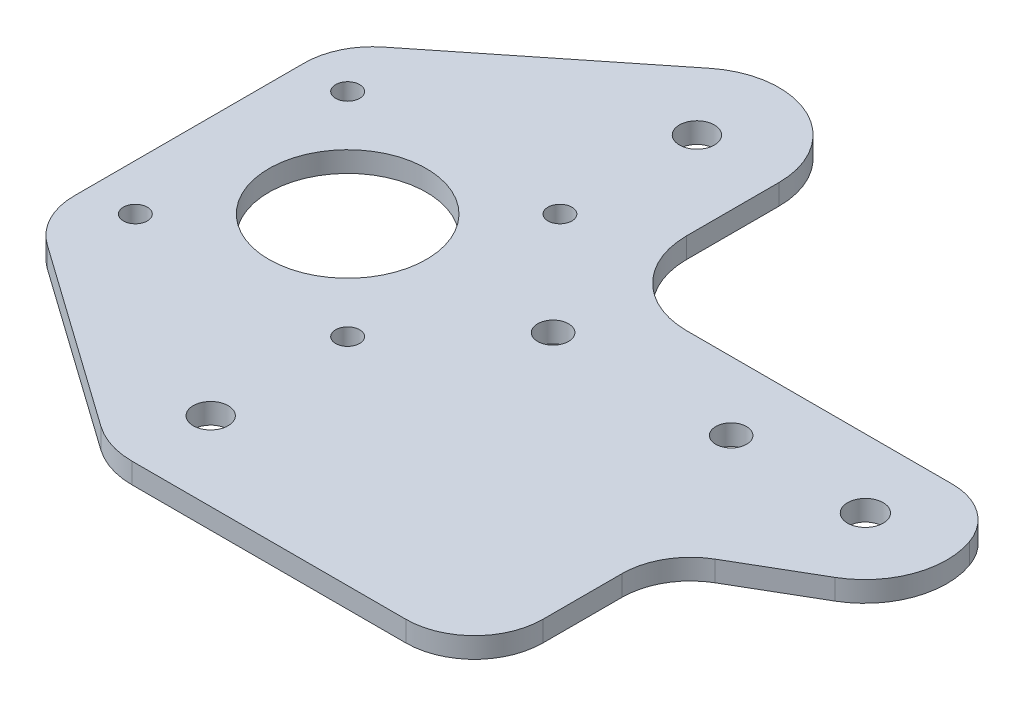
ISO-10303-21;
HEADER;
FILE_DESCRIPTION(('STEP AP214'),'2;1');
FILE_NAME('part.step','',(''),(''),'','','');
FILE_SCHEMA(('AUTOMOTIVE_DESIGN { 1 0 10303 214 1 1 1 1 }'));
ENDSEC;
DATA;
#1=APPLICATION_CONTEXT('core data for automotive mechanical design processes');
#2=APPLICATION_PROTOCOL_DEFINITION('international standard','automotive_design',2000,#1);
#3=PRODUCT_CONTEXT('',#1,'mechanical');
#4=PRODUCT('Part','Part','',(#3));
#5=PRODUCT_RELATED_PRODUCT_CATEGORY('part','',(#4));
#6=PRODUCT_DEFINITION_FORMATION('','',#4);
#7=PRODUCT_DEFINITION_CONTEXT('part definition',#1,'design');
#8=PRODUCT_DEFINITION('design','',#6,#7);
#9=PRODUCT_DEFINITION_SHAPE('','',#8);
#10=(LENGTH_UNIT() NAMED_UNIT(*) SI_UNIT(.MILLI.,.METRE.));
#11=(NAMED_UNIT(*) PLANE_ANGLE_UNIT() SI_UNIT($,.RADIAN.));
#12=(NAMED_UNIT(*) SI_UNIT($,.STERADIAN.) SOLID_ANGLE_UNIT());
#13=UNCERTAINTY_MEASURE_WITH_UNIT(LENGTH_MEASURE(1.E-05),#10,'distance_accuracy_value','');
#14=(GEOMETRIC_REPRESENTATION_CONTEXT(3) GLOBAL_UNCERTAINTY_ASSIGNED_CONTEXT((#13)) GLOBAL_UNIT_ASSIGNED_CONTEXT((#10,
#11,#12)) REPRESENTATION_CONTEXT('',''));
#15=CARTESIAN_POINT('',(0.,0.,0.));
#16=DIRECTION('',(0.,0.,1.));
#17=DIRECTION('',(1.,0.,0.));
#18=AXIS2_PLACEMENT_3D('',#15,#16,#17);
#19=CARTESIAN_POINT('',(10.,3.,16.785));
#20=DIRECTION('',(0.,1.,0.));
#21=DIRECTION('',(0.,0.,1.));
#22=AXIS2_PLACEMENT_3D('',#19,#20,#21);
#23=PLANE('',#22);
#24=CARTESIAN_POINT('',(97.86,3.,-0.877609719009707));
#25=DIRECTION('',(0.,1.,0.));
#26=DIRECTION('',(0.,0.,1.));
#27=AXIS2_PLACEMENT_3D('',#24,#25,#26);
#28=CIRCLE('',#27,2.6);
#29=CARTESIAN_POINT('',(97.86,3.,1.7223902809903));
#30=VERTEX_POINT('',#29);
#31=EDGE_CURVE('E386',#30,#30,#28,.T.);
#32=ORIENTED_EDGE('',*,*,#31,.F.);
#33=EDGE_LOOP('',(#32));
#34=FACE_BOUND('',#33,.T.);
#35=CARTESIAN_POINT('',(6.76719180136396,3.,-16.3694187931699));
#36=DIRECTION('',(0.,1.,0.));
#37=DIRECTION('',(0.,0.,1.));
#38=AXIS2_PLACEMENT_3D('',#35,#36,#37);
#39=CIRCLE('',#38,1.75);
#40=CARTESIAN_POINT('',(6.76719180136396,3.,-14.6194187931699));
#41=VERTEX_POINT('',#40);
#42=EDGE_CURVE('E398',#41,#41,#39,.T.);
#43=ORIENTED_EDGE('',*,*,#42,.F.);
#44=EDGE_LOOP('',(#43));
#45=FACE_BOUND('',#44,.T.);
#46=CARTESIAN_POINT('',(37.767191801364,3.,14.6305812068301));
#47=DIRECTION('',(0.,1.,0.));
#48=DIRECTION('',(0.,0.,1.));
#49=AXIS2_PLACEMENT_3D('',#46,#47,#48);
#50=CIRCLE('',#49,1.75);
#51=CARTESIAN_POINT('',(37.767191801364,3.,16.3805812068301));
#52=VERTEX_POINT('',#51);
#53=EDGE_CURVE('E410',#52,#52,#50,.T.);
#54=ORIENTED_EDGE('',*,*,#53,.F.);
#55=EDGE_LOOP('',(#54));
#56=FACE_BOUND('',#55,.T.);
#57=CARTESIAN_POINT('',(22.26,3.,-0.877609719009707));
#58=DIRECTION('',(0.,1.,0.));
#59=DIRECTION('',(0.,0.,1.));
#60=AXIS2_PLACEMENT_3D('',#57,#58,#59);
#61=CIRCLE('',#60,11.5);
#62=CARTESIAN_POINT('',(22.26,3.,10.6223902809903));
#63=VERTEX_POINT('',#62);
#64=EDGE_CURVE('E422',#63,#63,#61,.T.);
#65=ORIENTED_EDGE('',*,*,#64,.F.);
#66=EDGE_LOOP('',(#65));
#67=FACE_BOUND('',#66,.T.);
#68=CARTESIAN_POINT('',(37.7671918013639,3.,-36.3694187931698));
#69=DIRECTION('',(0.,1.,0.));
#70=DIRECTION('',(0.,0.,1.));
#71=AXIS2_PLACEMENT_3D('',#68,#69,#70);
#72=CIRCLE('',#71,2.55);
#73=CARTESIAN_POINT('',(37.7671918013639,3.,-33.8194187931698));
#74=VERTEX_POINT('',#73);
#75=EDGE_CURVE('E194',#74,#74,#72,.T.);
#76=ORIENTED_EDGE('',*,*,#75,.F.);
#77=EDGE_LOOP('',(#76));
#78=FACE_BOUND('',#77,.T.);
#79=CARTESIAN_POINT('',(10.,3.,16.785));
#80=DIRECTION('',(0.,1.,0.));
#81=DIRECTION('',(0.,0.,1.));
#82=AXIS2_PLACEMENT_3D('',#79,#80,#81);
#83=CIRCLE('',#82,10.);
#84=CARTESIAN_POINT('',(0.,3.,16.785));
#85=VERTEX_POINT('',#84);
#86=CARTESIAN_POINT('',(4.21859387166806,3.,24.944371494134));
#87=VERTEX_POINT('',#86);
#88=EDGE_CURVE('E223',#85,#87,#83,.T.);
#89=ORIENTED_EDGE('',*,*,#88,.T.);
#90=DIRECTION('',(0.815937149413396,0.,0.578140612833194));
#91=VECTOR('',#90,1.);
#92=CARTESIAN_POINT('',(4.21859387166806,3.,24.944371494134));
#93=LINE('',#92,#91);
#94=CARTESIAN_POINT('',(31.1200416878277,3.,44.0056674992444));
#95=VERTEX_POINT('',#94);
#96=EDGE_CURVE('E126',#87,#95,#93,.T.);
#97=ORIENTED_EDGE('',*,*,#96,.T.);
#98=CARTESIAN_POINT('',(37.7686587354095,3.,34.6223902809903));
#99=DIRECTION('',(0.,1.,0.));
#100=DIRECTION('',(0.,0.,1.));
#101=AXIS2_PLACEMENT_3D('',#98,#99,#100);
#102=CIRCLE('',#101,11.5);
#103=CARTESIAN_POINT('',(37.7686587354095,3.,46.1223902809903));
#104=VERTEX_POINT('',#103);
#105=EDGE_CURVE('E265',#95,#104,#102,.T.);
#106=ORIENTED_EDGE('',*,*,#105,.T.);
#107=DIRECTION('',(1.,0.,0.));
#108=VECTOR('',#107,1.);
#109=CARTESIAN_POINT('',(37.7686587354095,3.,46.1223902809903));
#110=LINE('',#109,#108);
#111=CARTESIAN_POINT('',(77.7686587354095,3.,46.1223902809904));
#112=VERTEX_POINT('',#111);
#113=EDGE_CURVE('E284',#104,#112,#110,.T.);
#114=ORIENTED_EDGE('',*,*,#113,.T.);
#115=CARTESIAN_POINT('',(77.7686587354095,3.,36.1223902809903));
#116=DIRECTION('',(0.,1.,0.));
#117=DIRECTION('',(0.,0.,1.));
#118=AXIS2_PLACEMENT_3D('',#115,#116,#117);
#119=CIRCLE('',#118,10.0000000000001);
#120=CARTESIAN_POINT('',(87.7686587354096,3.,36.1223902809903));
#121=VERTEX_POINT('',#120);
#122=EDGE_CURVE('E281',#112,#121,#119,.T.);
#123=ORIENTED_EDGE('',*,*,#122,.T.);
#124=DIRECTION('',(0.,0.,-1.));
#125=VECTOR('',#124,1.);
#126=CARTESIAN_POINT('',(87.7686587354096,3.,36.1223902809903));
#127=LINE('',#126,#125);
#128=CARTESIAN_POINT('',(87.7686587354095,3.,24.5723902809903));
#129=VERTEX_POINT('',#128);
#130=EDGE_CURVE('E283',#121,#129,#127,.T.);
#131=ORIENTED_EDGE('',*,*,#130,.T.);
#132=CARTESIAN_POINT('',(97.7686587354083,3.,24.5723902809902));
#133=DIRECTION('',(0.,-1.,0.));
#134=DIRECTION('',(0.,0.,-1.));
#135=AXIS2_PLACEMENT_3D('',#132,#133,#134);
#136=CIRCLE('',#135,9.99999999999879);
#137=CARTESIAN_POINT('',(92.7384592691065,3.,15.9296422614541));
#138=VERTEX_POINT('',#137);
#139=EDGE_CURVE('E286',#129,#138,#136,.T.);
#140=ORIENTED_EDGE('',*,*,#139,.T.);
#141=DIRECTION('',(0.864274801953704,0.,-0.503019946630236));
#142=VECTOR('',#141,1.);
#143=CARTESIAN_POINT('',(92.7384592691065,3.,15.9296422614541));
#144=LINE('',#143,#142);
#145=CARTESIAN_POINT('',(103.801176734114,3.,9.49098694458715));
#146=VERTEX_POINT('',#145);
#147=EDGE_CURVE('E292',#138,#146,#144,.T.);
#148=ORIENTED_EDGE('',*,*,#147,.T.);
#149=CARTESIAN_POINT('',(97.7649373745511,3.,-0.880310678857306));
#150=DIRECTION('',(0.,1.,0.));
#151=DIRECTION('',(0.,0.,-1.));
#152=AXIS2_PLACEMENT_3D('',#149,#150,#151);
#153=CIRCLE('',#152,12.);
#154=CARTESIAN_POINT('',(109.093955081803,3.,-4.83674313610747));
#155=VERTEX_POINT('',#154);
#156=EDGE_CURVE('E294',#146,#155,#153,.T.);
#157=ORIENTED_EDGE('',*,*,#156,.T.);
#158=CARTESIAN_POINT('',(100.597191801364,3.,-1.86941879316985));
#159=DIRECTION('',(0.,1.,0.));
#160=DIRECTION('',(0.,0.,-1.));
#161=AXIS2_PLACEMENT_3D('',#158,#159,#160);
#162=CIRCLE('',#161,9.00000000000002);
#163=CARTESIAN_POINT('',(100.597191801364,3.,-10.8694187931699));
#164=VERTEX_POINT('',#163);
#165=EDGE_CURVE('E296',#155,#164,#162,.T.);
#166=ORIENTED_EDGE('',*,*,#165,.T.);
#167=DIRECTION('',(-1.,0.,0.));
#168=VECTOR('',#167,1.);
#169=CARTESIAN_POINT('',(61.767191801364,3.,-10.8694187931699));
#170=LINE('',#169,#168);
#171=CARTESIAN_POINT('',(61.767191801364,3.,-10.8694187931699));
#172=VERTEX_POINT('',#171);
#173=EDGE_CURVE('E298',#164,#172,#170,.T.);
#174=ORIENTED_EDGE('',*,*,#173,.T.);
#175=CARTESIAN_POINT('',(61.767191801364,3.,-22.8694187931698));
#176=DIRECTION('',(0.,-1.,0.));
#177=DIRECTION('',(0.,0.,1.));
#178=AXIS2_PLACEMENT_3D('',#175,#176,#177);
#179=CIRCLE('',#178,12.);
#180=CARTESIAN_POINT('',(49.767191801364,3.,-22.8694187931699));
#181=VERTEX_POINT('',#180);
#182=EDGE_CURVE('E300',#172,#181,#179,.T.);
#183=ORIENTED_EDGE('',*,*,#182,.T.);
#184=DIRECTION('',(0.,0.,-1.));
#185=VECTOR('',#184,1.);
#186=CARTESIAN_POINT('',(49.767191801364,3.,-36.3694187931699));
#187=LINE('',#186,#185);
#188=CARTESIAN_POINT('',(49.767191801364,3.,-36.3694187931699));
#189=VERTEX_POINT('',#188);
#190=EDGE_CURVE('E302',#181,#189,#187,.T.);
#191=ORIENTED_EDGE('',*,*,#190,.T.);
#192=CARTESIAN_POINT('',(37.7671918013639,3.,-36.3694187931698));
#193=DIRECTION('',(0.,1.,0.));
#194=DIRECTION('',(0.,0.,-1.));
#195=AXIS2_PLACEMENT_3D('',#192,#193,#194);
#196=CIRCLE('',#195,12.);
#197=CARTESIAN_POINT('',(30.2855481048173,3.,-45.7515831275824));
#198=VERTEX_POINT('',#197);
#199=EDGE_CURVE('E172',#189,#198,#196,.T.);
#200=ORIENTED_EDGE('',*,*,#199,.T.);
#201=DIRECTION('',(-0.781847027867714,0.,0.623470308045557));
#202=VECTOR('',#201,1.);
#203=CARTESIAN_POINT('',(3.76529691954443,3.,-24.6034702786772));
#204=LINE('',#203,#202);
#205=CARTESIAN_POINT('',(3.76529691954444,3.,-24.6034702786772));
#206=VERTEX_POINT('',#205);
#207=EDGE_CURVE('E166',#198,#206,#204,.T.);
#208=ORIENTED_EDGE('',*,*,#207,.T.);
#209=CARTESIAN_POINT('',(10.,3.,-16.785));
#210=DIRECTION('',(0.,1.,0.));
#211=DIRECTION('',(0.,0.,-1.));
#212=AXIS2_PLACEMENT_3D('',#209,#210,#211);
#213=CIRCLE('',#212,10.);
#214=CARTESIAN_POINT('',(0.,3.,-16.785));
#215=VERTEX_POINT('',#214);
#216=EDGE_CURVE('E170',#206,#215,#213,.T.);
#217=ORIENTED_EDGE('',*,*,#216,.T.);
#218=DIRECTION('',(0.,0.,1.));
#219=VECTOR('',#218,1.);
#220=CARTESIAN_POINT('',(0.,3.,16.785));
#221=LINE('',#220,#219);
#222=EDGE_CURVE('E56',#215,#85,#221,.T.);
#223=ORIENTED_EDGE('',*,*,#222,.T.);
#224=EDGE_LOOP('',(#89,#97,#106,#114,#123,#131,#140,#148,#157,#166,#174,#183,#191,#200,#208,
#217,#223));
#225=FACE_BOUND('',#224,.T.);
#226=CARTESIAN_POINT('',(37.7671918013639,3.,-16.3694187931698));
#227=DIRECTION('',(0.,1.,0.));
#228=DIRECTION('',(0.,0.,1.));
#229=AXIS2_PLACEMENT_3D('',#226,#227,#228);
#230=CIRCLE('',#229,1.75);
#231=CARTESIAN_POINT('',(37.7671918013639,3.,-14.6194187931698));
#232=VERTEX_POINT('',#231);
#233=EDGE_CURVE('E428',#232,#232,#230,.T.);
#234=ORIENTED_EDGE('',*,*,#233,.F.);
#235=EDGE_LOOP('',(#234));
#236=FACE_BOUND('',#235,.T.);
#237=CARTESIAN_POINT('',(52.26,3.,-0.877609719009707));
#238=DIRECTION('',(0.,1.,0.));
#239=DIRECTION('',(0.,0.,1.));
#240=AXIS2_PLACEMENT_3D('',#237,#238,#239);
#241=CIRCLE('',#240,2.25);
#242=CARTESIAN_POINT('',(52.26,3.,1.3723902809903));
#243=VERTEX_POINT('',#242);
#244=EDGE_CURVE('E416',#243,#243,#241,.T.);
#245=ORIENTED_EDGE('',*,*,#244,.F.);
#246=EDGE_LOOP('',(#245));
#247=FACE_BOUND('',#246,.T.);
#248=CARTESIAN_POINT('',(6.76719180136396,3.,14.6305812068301));
#249=DIRECTION('',(0.,1.,0.));
#250=DIRECTION('',(0.,0.,1.));
#251=AXIS2_PLACEMENT_3D('',#248,#249,#250);
#252=CIRCLE('',#251,1.75000000000001);
#253=CARTESIAN_POINT('',(6.76719180136396,3.,16.3805812068301));
#254=VERTEX_POINT('',#253);
#255=EDGE_CURVE('E404',#254,#254,#252,.T.);
#256=ORIENTED_EDGE('',*,*,#255,.F.);
#257=EDGE_LOOP('',(#256));
#258=FACE_BOUND('',#257,.T.);
#259=CARTESIAN_POINT('',(78.26,3.,-0.877609719009707));
#260=DIRECTION('',(0.,1.,0.));
#261=DIRECTION('',(0.,0.,1.));
#262=AXIS2_PLACEMENT_3D('',#259,#260,#261);
#263=CIRCLE('',#262,2.25);
#264=CARTESIAN_POINT('',(78.26,3.,1.37239028099029));
#265=VERTEX_POINT('',#264);
#266=EDGE_CURVE('E392',#265,#265,#263,.T.);
#267=ORIENTED_EDGE('',*,*,#266,.F.);
#268=EDGE_LOOP('',(#267));
#269=FACE_BOUND('',#268,.T.);
#270=CARTESIAN_POINT('',(37.767191801364,3.,34.6305812068301));
#271=DIRECTION('',(0.,1.,0.));
#272=DIRECTION('',(0.,0.,1.));
#273=AXIS2_PLACEMENT_3D('',#270,#271,#272);
#274=CIRCLE('',#273,2.55);
#275=CARTESIAN_POINT('',(37.767191801364,3.,37.1805812068301));
#276=VERTEX_POINT('',#275);
#277=EDGE_CURVE('E377',#276,#276,#274,.T.);
#278=ORIENTED_EDGE('',*,*,#277,.F.);
#279=EDGE_LOOP('',(#278));
#280=FACE_BOUND('',#279,.T.);
#281=ADVANCED_FACE('F39',(#34,#45,#56,#67,#78,#225,#236,#247,#258,#269,#280),#23,.T.);
#282=CARTESIAN_POINT('',(10.,0.,16.785));
#283=DIRECTION('',(0.,1.,0.));
#284=DIRECTION('',(0.,0.,1.));
#285=AXIS2_PLACEMENT_3D('',#282,#283,#284);
#286=PLANE('',#285);
#287=CARTESIAN_POINT('',(10.,0.,16.785));
#288=DIRECTION('',(0.,1.,0.));
#289=DIRECTION('',(0.,0.,1.));
#290=AXIS2_PLACEMENT_3D('',#287,#288,#289);
#291=CIRCLE('',#290,10.);
#292=CARTESIAN_POINT('',(0.,0.,16.785));
#293=VERTEX_POINT('',#292);
#294=CARTESIAN_POINT('',(4.21859387166806,0.,24.944371494134));
#295=VERTEX_POINT('',#294);
#296=EDGE_CURVE('E190',#293,#295,#291,.T.);
#297=ORIENTED_EDGE('',*,*,#296,.F.);
#298=DIRECTION('',(0.,0.,1.));
#299=VECTOR('',#298,1.);
#300=CARTESIAN_POINT('',(0.,0.,16.785));
#301=LINE('',#300,#299);
#302=CARTESIAN_POINT('',(0.,0.,-16.785));
#303=VERTEX_POINT('',#302);
#304=EDGE_CURVE('E118',#303,#293,#301,.T.);
#305=ORIENTED_EDGE('',*,*,#304,.F.);
#306=CARTESIAN_POINT('',(10.,0.,-16.785));
#307=DIRECTION('',(0.,1.,0.));
#308=DIRECTION('',(0.,0.,-1.));
#309=AXIS2_PLACEMENT_3D('',#306,#307,#308);
#310=CIRCLE('',#309,10.);
#311=CARTESIAN_POINT('',(3.76529691954444,0.,-24.6034702786772));
#312=VERTEX_POINT('',#311);
#313=EDGE_CURVE('E112',#312,#303,#310,.T.);
#314=ORIENTED_EDGE('',*,*,#313,.F.);
#315=DIRECTION('',(-0.781847027867714,0.,0.623470308045557));
#316=VECTOR('',#315,1.);
#317=CARTESIAN_POINT('',(3.76529691954443,0.,-24.6034702786772));
#318=LINE('',#317,#316);
#319=CARTESIAN_POINT('',(30.2855481048173,0.,-45.7515831275824));
#320=VERTEX_POINT('',#319);
#321=EDGE_CURVE('E180',#320,#312,#318,.T.);
#322=ORIENTED_EDGE('',*,*,#321,.F.);
#323=CARTESIAN_POINT('',(37.7671918013639,0.,-36.3694187931698));
#324=DIRECTION('',(0.,1.,0.));
#325=DIRECTION('',(0.,0.,-1.));
#326=AXIS2_PLACEMENT_3D('',#323,#324,#325);
#327=CIRCLE('',#326,12.);
#328=CARTESIAN_POINT('',(49.767191801364,0.,-36.3694187931699));
#329=VERTEX_POINT('',#328);
#330=EDGE_CURVE('E218',#329,#320,#327,.T.);
#331=ORIENTED_EDGE('',*,*,#330,.F.);
#332=DIRECTION('',(0.,0.,-1.));
#333=VECTOR('',#332,1.);
#334=CARTESIAN_POINT('',(49.767191801364,0.,-36.3694187931699));
#335=LINE('',#334,#333);
#336=CARTESIAN_POINT('',(49.767191801364,0.,-22.8694187931699));
#337=VERTEX_POINT('',#336);
#338=EDGE_CURVE('E216',#337,#329,#335,.T.);
#339=ORIENTED_EDGE('',*,*,#338,.F.);
#340=CARTESIAN_POINT('',(61.767191801364,0.,-22.8694187931698));
#341=DIRECTION('',(0.,-1.,0.));
#342=DIRECTION('',(0.,0.,1.));
#343=AXIS2_PLACEMENT_3D('',#340,#341,#342);
#344=CIRCLE('',#343,12.);
#345=CARTESIAN_POINT('',(61.767191801364,0.,-10.8694187931699));
#346=VERTEX_POINT('',#345);
#347=EDGE_CURVE('E214',#346,#337,#344,.T.);
#348=ORIENTED_EDGE('',*,*,#347,.F.);
#349=DIRECTION('',(-1.,0.,0.));
#350=VECTOR('',#349,1.);
#351=CARTESIAN_POINT('',(61.767191801364,0.,-10.8694187931699));
#352=LINE('',#351,#350);
#353=CARTESIAN_POINT('',(100.597191801364,0.,-10.8694187931699));
#354=VERTEX_POINT('',#353);
#355=EDGE_CURVE('E212',#354,#346,#352,.T.);
#356=ORIENTED_EDGE('',*,*,#355,.F.);
#357=CARTESIAN_POINT('',(100.597191801364,0.,-1.86941879316985));
#358=DIRECTION('',(0.,1.,0.));
#359=DIRECTION('',(0.,0.,-1.));
#360=AXIS2_PLACEMENT_3D('',#357,#358,#359);
#361=CIRCLE('',#360,9.00000000000002);
#362=CARTESIAN_POINT('',(109.093955081803,0.,-4.83674313610747));
#363=VERTEX_POINT('',#362);
#364=EDGE_CURVE('E210',#363,#354,#361,.T.);
#365=ORIENTED_EDGE('',*,*,#364,.F.);
#366=CARTESIAN_POINT('',(97.7649373745511,0.,-0.880310678857306));
#367=DIRECTION('',(0.,1.,0.));
#368=DIRECTION('',(0.,0.,-1.));
#369=AXIS2_PLACEMENT_3D('',#366,#367,#368);
#370=CIRCLE('',#369,12.);
#371=CARTESIAN_POINT('',(103.801176734114,0.,9.49098694458715));
#372=VERTEX_POINT('',#371);
#373=EDGE_CURVE('E208',#372,#363,#370,.T.);
#374=ORIENTED_EDGE('',*,*,#373,.F.);
#375=DIRECTION('',(0.864274801953704,0.,-0.503019946630236));
#376=VECTOR('',#375,1.);
#377=CARTESIAN_POINT('',(92.7384592691065,0.,15.9296422614541));
#378=LINE('',#377,#376);
#379=CARTESIAN_POINT('',(92.7384592691065,0.,15.9296422614541));
#380=VERTEX_POINT('',#379);
#381=EDGE_CURVE('E206',#380,#372,#378,.T.);
#382=ORIENTED_EDGE('',*,*,#381,.F.);
#383=CARTESIAN_POINT('',(97.7686587354083,0.,24.5723902809902));
#384=DIRECTION('',(0.,-1.,0.));
#385=DIRECTION('',(0.,0.,-1.));
#386=AXIS2_PLACEMENT_3D('',#383,#384,#385);
#387=CIRCLE('',#386,9.99999999999879);
#388=CARTESIAN_POINT('',(87.7686587354095,0.,24.5723902809903));
#389=VERTEX_POINT('',#388);
#390=EDGE_CURVE('E204',#389,#380,#387,.T.);
#391=ORIENTED_EDGE('',*,*,#390,.F.);
#392=DIRECTION('',(0.,0.,-1.));
#393=VECTOR('',#392,1.);
#394=CARTESIAN_POINT('',(87.7686587354096,0.,36.1223902809903));
#395=LINE('',#394,#393);
#396=CARTESIAN_POINT('',(87.7686587354096,0.,36.1223902809903));
#397=VERTEX_POINT('',#396);
#398=EDGE_CURVE('E202',#397,#389,#395,.T.);
#399=ORIENTED_EDGE('',*,*,#398,.F.);
#400=CARTESIAN_POINT('',(77.7686587354095,0.,36.1223902809903));
#401=DIRECTION('',(0.,1.,0.));
#402=DIRECTION('',(0.,0.,1.));
#403=AXIS2_PLACEMENT_3D('',#400,#401,#402);
#404=CIRCLE('',#403,10.0000000000001);
#405=CARTESIAN_POINT('',(77.7686587354095,0.,46.1223902809904));
#406=VERTEX_POINT('',#405);
#407=EDGE_CURVE('E200',#406,#397,#404,.T.);
#408=ORIENTED_EDGE('',*,*,#407,.F.);
#409=DIRECTION('',(1.,0.,0.));
#410=VECTOR('',#409,1.);
#411=CARTESIAN_POINT('',(37.7686587354095,0.,46.1223902809903));
#412=LINE('',#411,#410);
#413=CARTESIAN_POINT('',(37.7686587354095,0.,46.1223902809903));
#414=VERTEX_POINT('',#413);
#415=EDGE_CURVE('E198',#414,#406,#412,.T.);
#416=ORIENTED_EDGE('',*,*,#415,.F.);
#417=CARTESIAN_POINT('',(37.7686587354095,0.,34.6223902809903));
#418=DIRECTION('',(0.,1.,0.));
#419=DIRECTION('',(0.,0.,1.));
#420=AXIS2_PLACEMENT_3D('',#417,#418,#419);
#421=CIRCLE('',#420,11.5);
#422=CARTESIAN_POINT('',(31.1200416878277,0.,44.0056674992444));
#423=VERTEX_POINT('',#422);
#424=EDGE_CURVE('E196',#423,#414,#421,.T.);
#425=ORIENTED_EDGE('',*,*,#424,.F.);
#426=DIRECTION('',(0.815937149413396,0.,0.578140612833194));
#427=VECTOR('',#426,1.);
#428=CARTESIAN_POINT('',(4.21859387166806,0.,24.944371494134));
#429=LINE('',#428,#427);
#430=EDGE_CURVE('E193',#295,#423,#429,.T.);
#431=ORIENTED_EDGE('',*,*,#430,.F.);
#432=EDGE_LOOP('',(#297,#305,#314,#322,#331,#339,#348,#356,#365,#374,#382,#391,#399,#408,#416,
#425,#431));
#433=FACE_BOUND('',#432,.T.);
#434=CARTESIAN_POINT('',(37.7671918013639,0.,-36.3694187931698));
#435=DIRECTION('',(0.,1.,0.));
#436=DIRECTION('',(0.,0.,1.));
#437=AXIS2_PLACEMENT_3D('',#434,#435,#436);
#438=CIRCLE('',#437,2.55);
#439=CARTESIAN_POINT('',(37.7671918013639,0.,-33.8194187931698));
#440=VERTEX_POINT('',#439);
#441=EDGE_CURVE('E431',#440,#440,#438,.T.);
#442=ORIENTED_EDGE('',*,*,#441,.T.);
#443=EDGE_LOOP('',(#442));
#444=FACE_BOUND('',#443,.T.);
#445=CARTESIAN_POINT('',(37.7671918013639,0.,-16.3694187931698));
#446=DIRECTION('',(0.,1.,0.));
#447=DIRECTION('',(0.,0.,1.));
#448=AXIS2_PLACEMENT_3D('',#445,#446,#447);
#449=CIRCLE('',#448,1.75);
#450=CARTESIAN_POINT('',(37.7671918013639,0.,-14.6194187931698));
#451=VERTEX_POINT('',#450);
#452=EDGE_CURVE('E425',#451,#451,#449,.T.);
#453=ORIENTED_EDGE('',*,*,#452,.T.);
#454=EDGE_LOOP('',(#453));
#455=FACE_BOUND('',#454,.T.);
#456=CARTESIAN_POINT('',(22.26,0.,-0.877609719009707));
#457=DIRECTION('',(0.,1.,0.));
#458=DIRECTION('',(0.,0.,1.));
#459=AXIS2_PLACEMENT_3D('',#456,#457,#458);
#460=CIRCLE('',#459,11.5);
#461=CARTESIAN_POINT('',(22.26,0.,10.6223902809903));
#462=VERTEX_POINT('',#461);
#463=EDGE_CURVE('E419',#462,#462,#460,.T.);
#464=ORIENTED_EDGE('',*,*,#463,.T.);
#465=EDGE_LOOP('',(#464));
#466=FACE_BOUND('',#465,.T.);
#467=CARTESIAN_POINT('',(52.26,0.,-0.877609719009707));
#468=DIRECTION('',(0.,1.,0.));
#469=DIRECTION('',(0.,0.,1.));
#470=AXIS2_PLACEMENT_3D('',#467,#468,#469);
#471=CIRCLE('',#470,2.25);
#472=CARTESIAN_POINT('',(52.26,0.,1.3723902809903));
#473=VERTEX_POINT('',#472);
#474=EDGE_CURVE('E413',#473,#473,#471,.T.);
#475=ORIENTED_EDGE('',*,*,#474,.T.);
#476=EDGE_LOOP('',(#475));
#477=FACE_BOUND('',#476,.T.);
#478=CARTESIAN_POINT('',(37.767191801364,0.,14.6305812068301));
#479=DIRECTION('',(0.,1.,0.));
#480=DIRECTION('',(0.,0.,1.));
#481=AXIS2_PLACEMENT_3D('',#478,#479,#480);
#482=CIRCLE('',#481,1.75);
#483=CARTESIAN_POINT('',(37.767191801364,0.,16.3805812068301));
#484=VERTEX_POINT('',#483);
#485=EDGE_CURVE('E407',#484,#484,#482,.T.);
#486=ORIENTED_EDGE('',*,*,#485,.T.);
#487=EDGE_LOOP('',(#486));
#488=FACE_BOUND('',#487,.T.);
#489=CARTESIAN_POINT('',(6.76719180136396,0.,14.6305812068301));
#490=DIRECTION('',(0.,1.,0.));
#491=DIRECTION('',(0.,0.,1.));
#492=AXIS2_PLACEMENT_3D('',#489,#490,#491);
#493=CIRCLE('',#492,1.75000000000001);
#494=CARTESIAN_POINT('',(6.76719180136396,0.,16.3805812068301));
#495=VERTEX_POINT('',#494);
#496=EDGE_CURVE('E401',#495,#495,#493,.T.);
#497=ORIENTED_EDGE('',*,*,#496,.T.);
#498=EDGE_LOOP('',(#497));
#499=FACE_BOUND('',#498,.T.);
#500=CARTESIAN_POINT('',(6.76719180136396,0.,-16.3694187931699));
#501=DIRECTION('',(0.,1.,0.));
#502=DIRECTION('',(0.,0.,1.));
#503=AXIS2_PLACEMENT_3D('',#500,#501,#502);
#504=CIRCLE('',#503,1.75);
#505=CARTESIAN_POINT('',(6.76719180136396,0.,-14.6194187931699));
#506=VERTEX_POINT('',#505);
#507=EDGE_CURVE('E395',#506,#506,#504,.T.);
#508=ORIENTED_EDGE('',*,*,#507,.T.);
#509=EDGE_LOOP('',(#508));
#510=FACE_BOUND('',#509,.T.);
#511=CARTESIAN_POINT('',(78.26,0.,-0.877609719009707));
#512=DIRECTION('',(0.,1.,0.));
#513=DIRECTION('',(0.,0.,1.));
#514=AXIS2_PLACEMENT_3D('',#511,#512,#513);
#515=CIRCLE('',#514,2.25);
#516=CARTESIAN_POINT('',(78.26,0.,1.37239028099029));
#517=VERTEX_POINT('',#516);
#518=EDGE_CURVE('E389',#517,#517,#515,.T.);
#519=ORIENTED_EDGE('',*,*,#518,.T.);
#520=EDGE_LOOP('',(#519));
#521=FACE_BOUND('',#520,.T.);
#522=CARTESIAN_POINT('',(97.86,0.,-0.877609719009707));
#523=DIRECTION('',(0.,1.,0.));
#524=DIRECTION('',(0.,0.,1.));
#525=AXIS2_PLACEMENT_3D('',#522,#523,#524);
#526=CIRCLE('',#525,2.6);
#527=CARTESIAN_POINT('',(97.86,0.,1.7223902809903));
#528=VERTEX_POINT('',#527);
#529=EDGE_CURVE('E383',#528,#528,#526,.T.);
#530=ORIENTED_EDGE('',*,*,#529,.T.);
#531=EDGE_LOOP('',(#530));
#532=FACE_BOUND('',#531,.T.);
#533=CARTESIAN_POINT('',(37.767191801364,0.,34.6305812068301));
#534=DIRECTION('',(0.,1.,0.));
#535=DIRECTION('',(0.,0.,1.));
#536=AXIS2_PLACEMENT_3D('',#533,#534,#535);
#537=CIRCLE('',#536,2.55);
#538=CARTESIAN_POINT('',(37.767191801364,0.,37.1805812068301));
#539=VERTEX_POINT('',#538);
#540=EDGE_CURVE('E380',#539,#539,#537,.T.);
#541=ORIENTED_EDGE('',*,*,#540,.T.);
#542=EDGE_LOOP('',(#541));
#543=FACE_BOUND('',#542,.T.);
#544=ADVANCED_FACE('F269',(#433,#444,#455,#466,#477,#488,#499,#510,#521,#532,#543),#286,.F.);
#545=CARTESIAN_POINT('',(10.,3.,16.785));
#546=DIRECTION('',(0.,-1.,0.));
#547=DIRECTION('',(0.,0.,-1.));
#548=AXIS2_PLACEMENT_3D('',#545,#546,#547);
#549=CYLINDRICAL_SURFACE('',#548,10.);
#550=ORIENTED_EDGE('',*,*,#296,.T.);
#551=DIRECTION('',(0.,-1.,0.));
#552=VECTOR('',#551,1.);
#553=CARTESIAN_POINT('',(4.21859387166806,3.,24.944371494134));
#554=LINE('',#553,#552);
#555=EDGE_CURVE('E11',#87,#295,#554,.T.);
#556=ORIENTED_EDGE('',*,*,#555,.F.);
#557=ORIENTED_EDGE('',*,*,#88,.F.);
#558=DIRECTION('',(0.,-1.,0.));
#559=VECTOR('',#558,1.);
#560=CARTESIAN_POINT('',(0.,3.,16.785));
#561=LINE('',#560,#559);
#562=EDGE_CURVE('E186',#85,#293,#561,.T.);
#563=ORIENTED_EDGE('',*,*,#562,.T.);
#564=EDGE_LOOP('',(#550,#556,#557,#563));
#565=FACE_BOUND('',#564,.T.);
#566=ADVANCED_FACE('F41',(#565),#549,.T.);
#567=CARTESIAN_POINT('',(4.21859387166806,3.,24.944371494134));
#568=DIRECTION('',(0.578140612833194,0.,-0.815937149413396));
#569=DIRECTION('',(-0.815937149413396,0.,-0.578140612833194));
#570=AXIS2_PLACEMENT_3D('',#567,#568,#569);
#571=PLANE('',#570);
#572=ORIENTED_EDGE('',*,*,#430,.T.);
#573=DIRECTION('',(0.,-1.,0.));
#574=VECTOR('',#573,1.);
#575=CARTESIAN_POINT('',(31.1200416878277,3.,44.0056674992444));
#576=LINE('',#575,#574);
#577=EDGE_CURVE('E48',#95,#423,#576,.T.);
#578=ORIENTED_EDGE('',*,*,#577,.F.);
#579=ORIENTED_EDGE('',*,*,#96,.F.);
#580=ORIENTED_EDGE('',*,*,#555,.T.);
#581=EDGE_LOOP('',(#572,#578,#579,#580));
#582=FACE_BOUND('',#581,.T.);
#583=ADVANCED_FACE('F655',(#582),#571,.F.);
#584=CARTESIAN_POINT('',(37.7686587354095,3.,34.6223902809903));
#585=DIRECTION('',(0.,-1.,0.));
#586=DIRECTION('',(0.,0.,-1.));
#587=AXIS2_PLACEMENT_3D('',#584,#585,#586);
#588=CYLINDRICAL_SURFACE('',#587,11.5);
#589=ORIENTED_EDGE('',*,*,#424,.T.);
#590=DIRECTION('',(0.,-1.,0.));
#591=VECTOR('',#590,1.);
#592=CARTESIAN_POINT('',(37.7686587354095,3.,46.1223902809903));
#593=LINE('',#592,#591);
#594=EDGE_CURVE('E257',#104,#414,#593,.T.);
#595=ORIENTED_EDGE('',*,*,#594,.F.);
#596=ORIENTED_EDGE('',*,*,#105,.F.);
#597=ORIENTED_EDGE('',*,*,#577,.T.);
#598=EDGE_LOOP('',(#589,#595,#596,#597));
#599=FACE_BOUND('',#598,.T.);
#600=ADVANCED_FACE('F263',(#599),#588,.T.);
#601=CARTESIAN_POINT('',(37.7686587354095,3.,46.1223902809903));
#602=DIRECTION('',(0.,0.,-1.));
#603=DIRECTION('',(-1.,0.,0.));
#604=AXIS2_PLACEMENT_3D('',#601,#602,#603);
#605=PLANE('',#604);
#606=ORIENTED_EDGE('',*,*,#415,.T.);
#607=DIRECTION('',(0.,-1.,0.));
#608=VECTOR('',#607,1.);
#609=CARTESIAN_POINT('',(77.7686587354095,3.,46.1223902809904));
#610=LINE('',#609,#608);
#611=EDGE_CURVE('E254',#112,#406,#610,.T.);
#612=ORIENTED_EDGE('',*,*,#611,.F.);
#613=ORIENTED_EDGE('',*,*,#113,.F.);
#614=ORIENTED_EDGE('',*,*,#594,.T.);
#615=EDGE_LOOP('',(#606,#612,#613,#614));
#616=FACE_BOUND('',#615,.T.);
#617=ADVANCED_FACE('F275',(#616),#605,.F.);
#618=CARTESIAN_POINT('',(77.7686587354095,3.,36.1223902809903));
#619=DIRECTION('',(0.,-1.,0.));
#620=DIRECTION('',(0.,0.,-1.));
#621=AXIS2_PLACEMENT_3D('',#618,#619,#620);
#622=CYLINDRICAL_SURFACE('',#621,10.0000000000001);
#623=ORIENTED_EDGE('',*,*,#407,.T.);
#624=DIRECTION('',(0.,-1.,0.));
#625=VECTOR('',#624,1.);
#626=CARTESIAN_POINT('',(87.7686587354096,3.,36.1223902809903));
#627=LINE('',#626,#625);
#628=EDGE_CURVE('E251',#121,#397,#627,.T.);
#629=ORIENTED_EDGE('',*,*,#628,.F.);
#630=ORIENTED_EDGE('',*,*,#122,.F.);
#631=ORIENTED_EDGE('',*,*,#611,.T.);
#632=EDGE_LOOP('',(#623,#629,#630,#631));
#633=FACE_BOUND('',#632,.T.);
#634=ADVANCED_FACE('F279',(#633),#622,.T.);
#635=CARTESIAN_POINT('',(87.7686587354096,3.,36.1223902809903));
#636=DIRECTION('',(-1.,0.,0.));
#637=DIRECTION('',(0.,0.,1.));
#638=AXIS2_PLACEMENT_3D('',#635,#636,#637);
#639=PLANE('',#638);
#640=ORIENTED_EDGE('',*,*,#398,.T.);
#641=DIRECTION('',(0.,-1.,0.));
#642=VECTOR('',#641,1.);
#643=CARTESIAN_POINT('',(87.7686587354095,3.,24.5723902809903));
#644=LINE('',#643,#642);
#645=EDGE_CURVE('E248',#129,#389,#644,.T.);
#646=ORIENTED_EDGE('',*,*,#645,.F.);
#647=ORIENTED_EDGE('',*,*,#130,.F.);
#648=ORIENTED_EDGE('',*,*,#628,.T.);
#649=EDGE_LOOP('',(#640,#646,#647,#648));
#650=FACE_BOUND('',#649,.T.);
#651=ADVANCED_FACE('F620',(#650),#639,.F.);
#652=CARTESIAN_POINT('',(97.7686587354083,3.,24.5723902809902));
#653=DIRECTION('',(0.,-1.,0.));
#654=DIRECTION('',(0.,0.,-1.));
#655=AXIS2_PLACEMENT_3D('',#652,#653,#654);
#656=CYLINDRICAL_SURFACE('',#655,9.99999999999879);
#657=ORIENTED_EDGE('',*,*,#390,.T.);
#658=DIRECTION('',(0.,-1.,0.));
#659=VECTOR('',#658,1.);
#660=CARTESIAN_POINT('',(92.7384592691065,3.,15.9296422614541));
#661=LINE('',#660,#659);
#662=EDGE_CURVE('E245',#138,#380,#661,.T.);
#663=ORIENTED_EDGE('',*,*,#662,.F.);
#664=ORIENTED_EDGE('',*,*,#139,.F.);
#665=ORIENTED_EDGE('',*,*,#645,.T.);
#666=EDGE_LOOP('',(#657,#663,#664,#665));
#667=FACE_BOUND('',#666,.T.);
#668=ADVANCED_FACE('F610',(#667),#656,.F.);
#669=CARTESIAN_POINT('',(92.7384592691065,3.,15.9296422614541));
#670=DIRECTION('',(-0.503019946630236,0.,-0.864274801953704));
#671=DIRECTION('',(-0.864274801953704,0.,0.503019946630236));
#672=AXIS2_PLACEMENT_3D('',#669,#670,#671);
#673=PLANE('',#672);
#674=ORIENTED_EDGE('',*,*,#381,.T.);
#675=DIRECTION('',(0.,-1.,0.));
#676=VECTOR('',#675,1.);
#677=CARTESIAN_POINT('',(103.801176734114,3.,9.49098694458715));
#678=LINE('',#677,#676);
#679=EDGE_CURVE('E242',#146,#372,#678,.T.);
#680=ORIENTED_EDGE('',*,*,#679,.F.);
#681=ORIENTED_EDGE('',*,*,#147,.F.);
#682=ORIENTED_EDGE('',*,*,#662,.T.);
#683=EDGE_LOOP('',(#674,#680,#681,#682));
#684=FACE_BOUND('',#683,.T.);
#685=ADVANCED_FACE('F600',(#684),#673,.F.);
#686=CARTESIAN_POINT('',(97.7649373745511,3.,-0.880310678857306));
#687=DIRECTION('',(0.,-1.,0.));
#688=DIRECTION('',(0.,0.,-1.));
#689=AXIS2_PLACEMENT_3D('',#686,#687,#688);
#690=CYLINDRICAL_SURFACE('',#689,12.);
#691=ORIENTED_EDGE('',*,*,#373,.T.);
#692=DIRECTION('',(0.,-1.,0.));
#693=VECTOR('',#692,1.);
#694=CARTESIAN_POINT('',(109.093955081803,3.,-4.83674313610747));
#695=LINE('',#694,#693);
#696=EDGE_CURVE('E239',#155,#363,#695,.T.);
#697=ORIENTED_EDGE('',*,*,#696,.F.);
#698=ORIENTED_EDGE('',*,*,#156,.F.);
#699=ORIENTED_EDGE('',*,*,#679,.T.);
#700=EDGE_LOOP('',(#691,#697,#698,#699));
#701=FACE_BOUND('',#700,.T.);
#702=ADVANCED_FACE('F590',(#701),#690,.T.);
#703=CARTESIAN_POINT('',(100.597191801364,3.,-1.86941879316985));
#704=DIRECTION('',(0.,-1.,0.));
#705=DIRECTION('',(0.,0.,-1.));
#706=AXIS2_PLACEMENT_3D('',#703,#704,#705);
#707=CYLINDRICAL_SURFACE('',#706,9.00000000000002);
#708=ORIENTED_EDGE('',*,*,#364,.T.);
#709=DIRECTION('',(0.,-1.,0.));
#710=VECTOR('',#709,1.);
#711=CARTESIAN_POINT('',(100.597191801364,3.,-10.8694187931699));
#712=LINE('',#711,#710);
#713=EDGE_CURVE('E236',#164,#354,#712,.T.);
#714=ORIENTED_EDGE('',*,*,#713,.F.);
#715=ORIENTED_EDGE('',*,*,#165,.F.);
#716=ORIENTED_EDGE('',*,*,#696,.T.);
#717=EDGE_LOOP('',(#708,#714,#715,#716));
#718=FACE_BOUND('',#717,.T.);
#719=ADVANCED_FACE('F580',(#718),#707,.T.);
#720=CARTESIAN_POINT('',(61.767191801364,3.,-10.8694187931699));
#721=DIRECTION('',(0.,0.,1.));
#722=DIRECTION('',(1.,0.,0.));
#723=AXIS2_PLACEMENT_3D('',#720,#721,#722);
#724=PLANE('',#723);
#725=ORIENTED_EDGE('',*,*,#355,.T.);
#726=DIRECTION('',(0.,-1.,0.));
#727=VECTOR('',#726,1.);
#728=CARTESIAN_POINT('',(61.767191801364,3.,-10.8694187931699));
#729=LINE('',#728,#727);
#730=EDGE_CURVE('E233',#172,#346,#729,.T.);
#731=ORIENTED_EDGE('',*,*,#730,.F.);
#732=ORIENTED_EDGE('',*,*,#173,.F.);
#733=ORIENTED_EDGE('',*,*,#713,.T.);
#734=EDGE_LOOP('',(#725,#731,#732,#733));
#735=FACE_BOUND('',#734,.T.);
#736=ADVANCED_FACE('F570',(#735),#724,.F.);
#737=CARTESIAN_POINT('',(61.767191801364,3.,-22.8694187931698));
#738=DIRECTION('',(0.,-1.,0.));
#739=DIRECTION('',(0.,0.,-1.));
#740=AXIS2_PLACEMENT_3D('',#737,#738,#739);
#741=CYLINDRICAL_SURFACE('',#740,12.);
#742=ORIENTED_EDGE('',*,*,#347,.T.);
#743=DIRECTION('',(0.,-1.,0.));
#744=VECTOR('',#743,1.);
#745=CARTESIAN_POINT('',(49.767191801364,3.,-22.8694187931699));
#746=LINE('',#745,#744);
#747=EDGE_CURVE('E230',#181,#337,#746,.T.);
#748=ORIENTED_EDGE('',*,*,#747,.F.);
#749=ORIENTED_EDGE('',*,*,#182,.F.);
#750=ORIENTED_EDGE('',*,*,#730,.T.);
#751=EDGE_LOOP('',(#742,#748,#749,#750));
#752=FACE_BOUND('',#751,.T.);
#753=ADVANCED_FACE('F561',(#752),#741,.F.);
#754=CARTESIAN_POINT('',(49.767191801364,3.,-36.3694187931699));
#755=DIRECTION('',(-1.,0.,0.));
#756=DIRECTION('',(0.,0.,1.));
#757=AXIS2_PLACEMENT_3D('',#754,#755,#756);
#758=PLANE('',#757);
#759=ORIENTED_EDGE('',*,*,#338,.T.);
#760=DIRECTION('',(0.,-1.,0.));
#761=VECTOR('',#760,1.);
#762=CARTESIAN_POINT('',(49.767191801364,3.,-36.3694187931699));
#763=LINE('',#762,#761);
#764=EDGE_CURVE('E227',#189,#329,#763,.T.);
#765=ORIENTED_EDGE('',*,*,#764,.F.);
#766=ORIENTED_EDGE('',*,*,#190,.F.);
#767=ORIENTED_EDGE('',*,*,#747,.T.);
#768=EDGE_LOOP('',(#759,#765,#766,#767));
#769=FACE_BOUND('',#768,.T.);
#770=ADVANCED_FACE('F308',(#769),#758,.F.);
#771=CARTESIAN_POINT('',(37.7671918013639,3.,-36.3694187931698));
#772=DIRECTION('',(0.,-1.,0.));
#773=DIRECTION('',(0.,0.,-1.));
#774=AXIS2_PLACEMENT_3D('',#771,#772,#773);
#775=CYLINDRICAL_SURFACE('',#774,12.);
#776=ORIENTED_EDGE('',*,*,#330,.T.);
#777=DIRECTION('',(0.,-1.,0.));
#778=VECTOR('',#777,1.);
#779=CARTESIAN_POINT('',(30.2855481048173,3.,-45.7515831275824));
#780=LINE('',#779,#778);
#781=EDGE_CURVE('E181',#198,#320,#780,.T.);
#782=ORIENTED_EDGE('',*,*,#781,.F.);
#783=ORIENTED_EDGE('',*,*,#199,.F.);
#784=ORIENTED_EDGE('',*,*,#764,.T.);
#785=EDGE_LOOP('',(#776,#782,#783,#784));
#786=FACE_BOUND('',#785,.T.);
#787=ADVANCED_FACE('F312',(#786),#775,.T.);
#788=CARTESIAN_POINT('',(3.76529691954443,3.,-24.6034702786772));
#789=DIRECTION('',(0.623470308045557,0.,0.781847027867714));
#790=DIRECTION('',(0.781847027867714,0.,-0.623470308045557));
#791=AXIS2_PLACEMENT_3D('',#788,#789,#790);
#792=PLANE('',#791);
#793=ORIENTED_EDGE('',*,*,#321,.T.);
#794=DIRECTION('',(0.,-1.,0.));
#795=VECTOR('',#794,1.);
#796=CARTESIAN_POINT('',(3.76529691954444,3.,-24.6034702786772));
#797=LINE('',#796,#795);
#798=EDGE_CURVE('E177',#206,#312,#797,.T.);
#799=ORIENTED_EDGE('',*,*,#798,.F.);
#800=ORIENTED_EDGE('',*,*,#207,.F.);
#801=ORIENTED_EDGE('',*,*,#781,.T.);
#802=EDGE_LOOP('',(#793,#799,#800,#801));
#803=FACE_BOUND('',#802,.T.);
#804=ADVANCED_FACE('F178',(#803),#792,.F.);
#805=CARTESIAN_POINT('',(10.,3.,-16.785));
#806=DIRECTION('',(0.,-1.,0.));
#807=DIRECTION('',(0.,0.,-1.));
#808=AXIS2_PLACEMENT_3D('',#805,#806,#807);
#809=CYLINDRICAL_SURFACE('',#808,10.);
#810=ORIENTED_EDGE('',*,*,#313,.T.);
#811=DIRECTION('',(0.,-1.,0.));
#812=VECTOR('',#811,1.);
#813=CARTESIAN_POINT('',(0.,3.,-16.785));
#814=LINE('',#813,#812);
#815=EDGE_CURVE('E182',#215,#303,#814,.T.);
#816=ORIENTED_EDGE('',*,*,#815,.F.);
#817=ORIENTED_EDGE('',*,*,#216,.F.);
#818=ORIENTED_EDGE('',*,*,#798,.T.);
#819=EDGE_LOOP('',(#810,#816,#817,#818));
#820=FACE_BOUND('',#819,.T.);
#821=ADVANCED_FACE('F184',(#820),#809,.T.);
#822=CARTESIAN_POINT('',(0.,3.,16.785));
#823=DIRECTION('',(1.,0.,0.));
#824=DIRECTION('',(0.,0.,-1.));
#825=AXIS2_PLACEMENT_3D('',#822,#823,#824);
#826=PLANE('',#825);
#827=ORIENTED_EDGE('',*,*,#304,.T.);
#828=ORIENTED_EDGE('',*,*,#562,.F.);
#829=ORIENTED_EDGE('',*,*,#222,.F.);
#830=ORIENTED_EDGE('',*,*,#815,.T.);
#831=EDGE_LOOP('',(#827,#828,#829,#830));
#832=FACE_BOUND('',#831,.T.);
#833=ADVANCED_FACE('F316',(#832),#826,.F.);
#834=CARTESIAN_POINT('',(37.7671918013639,3.,-36.3694187931698));
#835=DIRECTION('',(0.,-1.,0.));
#836=DIRECTION('',(0.,0.,-1.));
#837=AXIS2_PLACEMENT_3D('',#834,#835,#836);
#838=CYLINDRICAL_SURFACE('',#837,2.55);
#839=ORIENTED_EDGE('',*,*,#75,.T.);
#840=EDGE_LOOP('',(#839));
#841=FACE_BOUND('',#840,.T.);
#842=ORIENTED_EDGE('',*,*,#441,.F.);
#843=EDGE_LOOP('',(#842));
#844=FACE_BOUND('',#843,.T.);
#845=ADVANCED_FACE('F318',(#841,#844),#838,.F.);
#846=CARTESIAN_POINT('',(37.7671918013639,3.,-16.3694187931698));
#847=DIRECTION('',(0.,-1.,0.));
#848=DIRECTION('',(0.,0.,-1.));
#849=AXIS2_PLACEMENT_3D('',#846,#847,#848);
#850=CYLINDRICAL_SURFACE('',#849,1.75);
#851=ORIENTED_EDGE('',*,*,#233,.T.);
#852=EDGE_LOOP('',(#851));
#853=FACE_BOUND('',#852,.T.);
#854=ORIENTED_EDGE('',*,*,#452,.F.);
#855=EDGE_LOOP('',(#854));
#856=FACE_BOUND('',#855,.T.);
#857=ADVANCED_FACE('F324',(#853,#856),#850,.F.);
#858=CARTESIAN_POINT('',(22.26,3.,-0.877609719009707));
#859=DIRECTION('',(0.,-1.,0.));
#860=DIRECTION('',(0.,0.,-1.));
#861=AXIS2_PLACEMENT_3D('',#858,#859,#860);
#862=CYLINDRICAL_SURFACE('',#861,11.5);
#863=ORIENTED_EDGE('',*,*,#64,.T.);
#864=EDGE_LOOP('',(#863));
#865=FACE_BOUND('',#864,.T.);
#866=ORIENTED_EDGE('',*,*,#463,.F.);
#867=EDGE_LOOP('',(#866));
#868=FACE_BOUND('',#867,.T.);
#869=ADVANCED_FACE('F340',(#865,#868),#862,.F.);
#870=CARTESIAN_POINT('',(52.26,3.,-0.877609719009707));
#871=DIRECTION('',(0.,-1.,0.));
#872=DIRECTION('',(0.,0.,-1.));
#873=AXIS2_PLACEMENT_3D('',#870,#871,#872);
#874=CYLINDRICAL_SURFACE('',#873,2.25);
#875=ORIENTED_EDGE('',*,*,#244,.T.);
#876=EDGE_LOOP('',(#875));
#877=FACE_BOUND('',#876,.T.);
#878=ORIENTED_EDGE('',*,*,#474,.F.);
#879=EDGE_LOOP('',(#878));
#880=FACE_BOUND('',#879,.T.);
#881=ADVANCED_FACE('F344',(#877,#880),#874,.F.);
#882=CARTESIAN_POINT('',(37.767191801364,3.,14.6305812068301));
#883=DIRECTION('',(0.,-1.,0.));
#884=DIRECTION('',(0.,0.,-1.));
#885=AXIS2_PLACEMENT_3D('',#882,#883,#884);
#886=CYLINDRICAL_SURFACE('',#885,1.75);
#887=ORIENTED_EDGE('',*,*,#53,.T.);
#888=EDGE_LOOP('',(#887));
#889=FACE_BOUND('',#888,.T.);
#890=ORIENTED_EDGE('',*,*,#485,.F.);
#891=EDGE_LOOP('',(#890));
#892=FACE_BOUND('',#891,.T.);
#893=ADVANCED_FACE('F348',(#889,#892),#886,.F.);
#894=CARTESIAN_POINT('',(6.76719180136396,3.,14.6305812068301));
#895=DIRECTION('',(0.,-1.,0.));
#896=DIRECTION('',(0.,0.,-1.));
#897=AXIS2_PLACEMENT_3D('',#894,#895,#896);
#898=CYLINDRICAL_SURFACE('',#897,1.75000000000001);
#899=ORIENTED_EDGE('',*,*,#255,.T.);
#900=EDGE_LOOP('',(#899));
#901=FACE_BOUND('',#900,.T.);
#902=ORIENTED_EDGE('',*,*,#496,.F.);
#903=EDGE_LOOP('',(#902));
#904=FACE_BOUND('',#903,.T.);
#905=ADVANCED_FACE('F352',(#901,#904),#898,.F.);
#906=CARTESIAN_POINT('',(6.76719180136396,3.,-16.3694187931699));
#907=DIRECTION('',(0.,-1.,0.));
#908=DIRECTION('',(0.,0.,-1.));
#909=AXIS2_PLACEMENT_3D('',#906,#907,#908);
#910=CYLINDRICAL_SURFACE('',#909,1.75);
#911=ORIENTED_EDGE('',*,*,#42,.T.);
#912=EDGE_LOOP('',(#911));
#913=FACE_BOUND('',#912,.T.);
#914=ORIENTED_EDGE('',*,*,#507,.F.);
#915=EDGE_LOOP('',(#914));
#916=FACE_BOUND('',#915,.T.);
#917=ADVANCED_FACE('F356',(#913,#916),#910,.F.);
#918=CARTESIAN_POINT('',(78.26,3.,-0.877609719009707));
#919=DIRECTION('',(0.,-1.,0.));
#920=DIRECTION('',(0.,0.,-1.));
#921=AXIS2_PLACEMENT_3D('',#918,#919,#920);
#922=CYLINDRICAL_SURFACE('',#921,2.25);
#923=ORIENTED_EDGE('',*,*,#266,.T.);
#924=EDGE_LOOP('',(#923));
#925=FACE_BOUND('',#924,.T.);
#926=ORIENTED_EDGE('',*,*,#518,.F.);
#927=EDGE_LOOP('',(#926));
#928=FACE_BOUND('',#927,.T.);
#929=ADVANCED_FACE('F360',(#925,#928),#922,.F.);
#930=CARTESIAN_POINT('',(97.86,3.,-0.877609719009707));
#931=DIRECTION('',(0.,-1.,0.));
#932=DIRECTION('',(0.,0.,-1.));
#933=AXIS2_PLACEMENT_3D('',#930,#931,#932);
#934=CYLINDRICAL_SURFACE('',#933,2.6);
#935=ORIENTED_EDGE('',*,*,#31,.T.);
#936=EDGE_LOOP('',(#935));
#937=FACE_BOUND('',#936,.T.);
#938=ORIENTED_EDGE('',*,*,#529,.F.);
#939=EDGE_LOOP('',(#938));
#940=FACE_BOUND('',#939,.T.);
#941=ADVANCED_FACE('F364',(#937,#940),#934,.F.);
#942=CARTESIAN_POINT('',(37.767191801364,3.,34.6305812068301));
#943=DIRECTION('',(0.,-1.,0.));
#944=DIRECTION('',(0.,0.,-1.));
#945=AXIS2_PLACEMENT_3D('',#942,#943,#944);
#946=CYLINDRICAL_SURFACE('',#945,2.55);
#947=ORIENTED_EDGE('',*,*,#277,.T.);
#948=EDGE_LOOP('',(#947));
#949=FACE_BOUND('',#948,.T.);
#950=ORIENTED_EDGE('',*,*,#540,.F.);
#951=EDGE_LOOP('',(#950));
#952=FACE_BOUND('',#951,.T.);
#953=ADVANCED_FACE('F368',(#949,#952),#946,.F.);
#954=CLOSED_SHELL('',(#281,#544,#566,#583,#600,#617,#634,#651,#668,#685,#702,#719,#736,#753,
#770,#787,#804,#821,#833,#845,#857,#869,#881,#893,#905,#917,#929,#941,#953));
#955=MANIFOLD_SOLID_BREP('B2',#954);
#956=ADVANCED_BREP_SHAPE_REPRESENTATION('',(#18,#955),#14);
#957=SHAPE_DEFINITION_REPRESENTATION(#9,#956);
ENDSEC;
END-ISO-10303-21;
